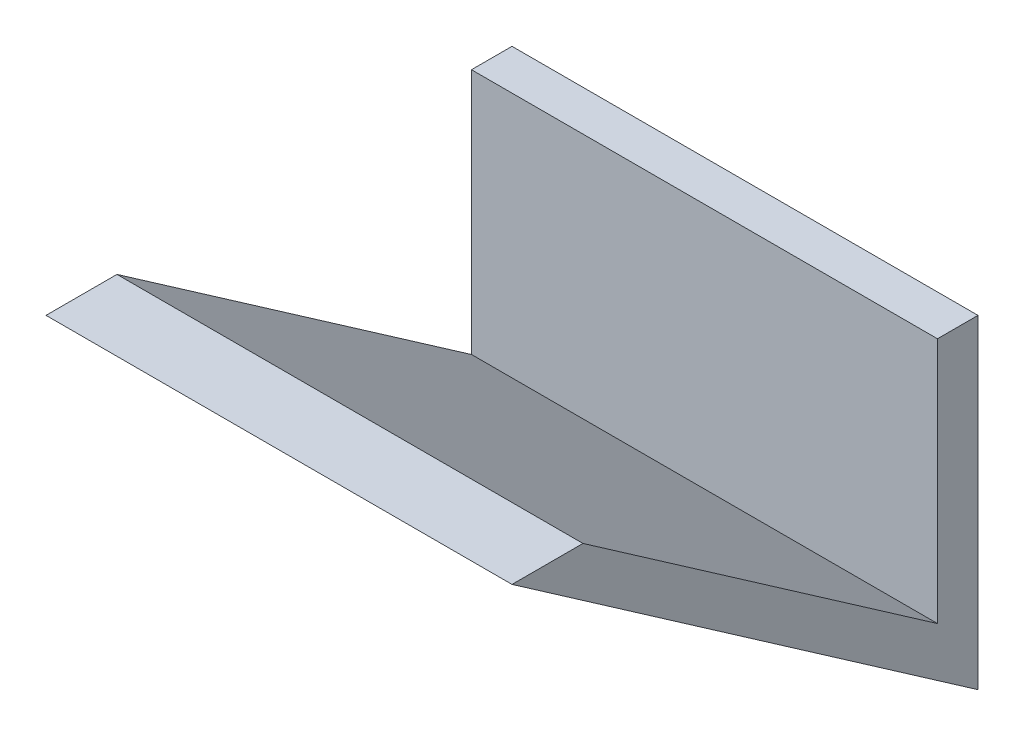
ISO-10303-21;
HEADER;
FILE_DESCRIPTION(('STEP AP214'),'2;1');
FILE_NAME('part.step','',(''),(''),'','','');
FILE_SCHEMA(('AUTOMOTIVE_DESIGN { 1 0 10303 214 1 1 1 1 }'));
ENDSEC;
DATA;
#1=APPLICATION_CONTEXT('core data for automotive mechanical design processes');
#2=APPLICATION_PROTOCOL_DEFINITION('international standard','automotive_design',2000,#1);
#3=PRODUCT_CONTEXT('',#1,'mechanical');
#4=PRODUCT('Part','Part','',(#3));
#5=PRODUCT_RELATED_PRODUCT_CATEGORY('part','',(#4));
#6=PRODUCT_DEFINITION_FORMATION('','',#4);
#7=PRODUCT_DEFINITION_CONTEXT('part definition',#1,'design');
#8=PRODUCT_DEFINITION('design','',#6,#7);
#9=PRODUCT_DEFINITION_SHAPE('','',#8);
#10=(LENGTH_UNIT() NAMED_UNIT(*) SI_UNIT(.MILLI.,.METRE.));
#11=(NAMED_UNIT(*) PLANE_ANGLE_UNIT() SI_UNIT($,.RADIAN.));
#12=(NAMED_UNIT(*) SI_UNIT($,.STERADIAN.) SOLID_ANGLE_UNIT());
#13=UNCERTAINTY_MEASURE_WITH_UNIT(LENGTH_MEASURE(1.E-05),#10,'distance_accuracy_value','');
#14=(GEOMETRIC_REPRESENTATION_CONTEXT(3) GLOBAL_UNCERTAINTY_ASSIGNED_CONTEXT((#13)) GLOBAL_UNIT_ASSIGNED_CONTEXT((#10,
#11,#12)) REPRESENTATION_CONTEXT('',''));
#15=CARTESIAN_POINT('',(0.,0.,0.));
#16=DIRECTION('',(0.,0.,1.));
#17=DIRECTION('',(1.,0.,0.));
#18=AXIS2_PLACEMENT_3D('',#15,#16,#17);
#19=CARTESIAN_POINT('',(-30.7528089887641,27.2640449438202,57.5));
#20=DIRECTION('',(0.,-1.,0.));
#21=DIRECTION('',(0.,0.,-1.));
#22=AXIS2_PLACEMENT_3D('',#19,#20,#21);
#23=PLANE('',#22);
#24=DIRECTION('',(0.,0.,-1.));
#25=VECTOR('',#24,1.);
#26=CARTESIAN_POINT('',(-30.7528089887641,27.2640449438202,57.5));
#27=LINE('',#26,#25);
#28=CARTESIAN_POINT('',(-30.7528089887641,27.2640449438202,5.));
#29=VERTEX_POINT('',#28);
#30=CARTESIAN_POINT('',(-30.7528089887641,27.2640449438202,0.));
#31=VERTEX_POINT('',#30);
#32=EDGE_CURVE('E63',#29,#31,#27,.T.);
#33=ORIENTED_EDGE('',*,*,#32,.F.);
#34=DIRECTION('',(1.,0.,0.));
#35=VECTOR('',#34,1.);
#36=CARTESIAN_POINT('',(-30.7528089887641,27.2640449438202,5.));
#37=LINE('',#36,#35);
#38=CARTESIAN_POINT('',(26.747191011236,27.2640449438202,5.));
#39=VERTEX_POINT('',#38);
#40=EDGE_CURVE('E101',#29,#39,#37,.T.);
#41=ORIENTED_EDGE('',*,*,#40,.T.);
#42=DIRECTION('',(0.,0.,-1.));
#43=VECTOR('',#42,1.);
#44=CARTESIAN_POINT('',(26.747191011236,27.2640449438202,57.5));
#45=LINE('',#44,#43);
#46=CARTESIAN_POINT('',(26.747191011236,27.2640449438202,0.));
#47=VERTEX_POINT('',#46);
#48=EDGE_CURVE('E48',#39,#47,#45,.T.);
#49=ORIENTED_EDGE('',*,*,#48,.T.);
#50=DIRECTION('',(-1.,0.,0.));
#51=VECTOR('',#50,1.);
#52=CARTESIAN_POINT('',(-30.7528089887641,27.2640449438202,0.));
#53=LINE('',#52,#51);
#54=EDGE_CURVE('E135',#47,#31,#53,.T.);
#55=ORIENTED_EDGE('',*,*,#54,.T.);
#56=EDGE_LOOP('',(#33,#41,#49,#55));
#57=FACE_BOUND('',#56,.T.);
#58=ADVANCED_FACE('F39',(#57),#23,.F.);
#59=CARTESIAN_POINT('',(-30.7528089887641,27.2640449438202,57.5));
#60=DIRECTION('',(1.,0.,0.));
#61=DIRECTION('',(0.,1.,0.));
#62=AXIS2_PLACEMENT_3D('',#59,#60,#61);
#63=PLANE('',#62);
#64=DIRECTION('',(0.,-0.5710644881986,-0.820905201785487));
#65=VECTOR('',#64,1.);
#66=CARTESIAN_POINT('',(-30.7528089887641,-3.16685691438766,5.));
#67=LINE('',#66,#65);
#68=CARTESIAN_POINT('',(-30.7528089887641,27.2640449438202,48.7444214211738));
#69=VERTEX_POINT('',#68);
#70=CARTESIAN_POINT('',(-30.7528089887641,-3.16685691438766,5.));
#71=VERTEX_POINT('',#70);
#72=EDGE_CURVE('E55',#69,#71,#67,.T.);
#73=ORIENTED_EDGE('',*,*,#72,.T.);
#74=DIRECTION('',(0.,1.,0.));
#75=VECTOR('',#74,1.);
#76=CARTESIAN_POINT('',(-30.7528089887641,27.2640449438202,5.));
#77=LINE('',#76,#75);
#78=EDGE_CURVE('E104',#71,#29,#77,.T.);
#79=ORIENTED_EDGE('',*,*,#78,.T.);
#80=ORIENTED_EDGE('',*,*,#32,.T.);
#81=DIRECTION('',(0.,-1.,0.));
#82=VECTOR('',#81,1.);
#83=CARTESIAN_POINT('',(-30.7528089887641,27.2640449438202,0.));
#84=LINE('',#83,#82);
#85=CARTESIAN_POINT('',(-30.752808988764,-12.7359550561798,0.));
#86=VERTEX_POINT('',#85);
#87=EDGE_CURVE('E129',#31,#86,#84,.T.);
#88=ORIENTED_EDGE('',*,*,#87,.T.);
#89=DIRECTION('',(0.,0.5710644881986,0.820905201785487));
#90=VECTOR('',#89,1.);
#91=CARTESIAN_POINT('',(-30.7528089887641,27.2640449438202,57.5));
#92=LINE('',#91,#90);
#93=CARTESIAN_POINT('',(-30.7528089887641,27.2640449438202,57.5));
#94=VERTEX_POINT('',#93);
#95=EDGE_CURVE('E126',#86,#94,#92,.T.);
#96=ORIENTED_EDGE('',*,*,#95,.T.);
#97=EDGE_CURVE('E112',#94,#69,#27,.T.);
#98=ORIENTED_EDGE('',*,*,#97,.T.);
#99=EDGE_LOOP('',(#73,#79,#80,#88,#96,#98));
#100=FACE_BOUND('',#99,.T.);
#101=ADVANCED_FACE('F41',(#100),#63,.F.);
#102=CARTESIAN_POINT('',(26.747191011236,27.2640449438202,57.5));
#103=DIRECTION('',(-1.,0.,0.));
#104=DIRECTION('',(0.,-1.,0.));
#105=AXIS2_PLACEMENT_3D('',#102,#103,#104);
#106=PLANE('',#105);
#107=ORIENTED_EDGE('',*,*,#48,.F.);
#108=DIRECTION('',(0.,1.,0.));
#109=VECTOR('',#108,1.);
#110=CARTESIAN_POINT('',(26.747191011236,27.2640449438202,5.));
#111=LINE('',#110,#109);
#112=CARTESIAN_POINT('',(26.747191011236,-3.16685691438765,5.));
#113=VERTEX_POINT('',#112);
#114=EDGE_CURVE('E114',#113,#39,#111,.T.);
#115=ORIENTED_EDGE('',*,*,#114,.F.);
#116=DIRECTION('',(0.,-0.5710644881986,-0.820905201785487));
#117=VECTOR('',#116,1.);
#118=CARTESIAN_POINT('',(26.747191011236,-3.16685691438765,5.));
#119=LINE('',#118,#117);
#120=CARTESIAN_POINT('',(26.747191011236,27.2640449438202,48.7444214211738));
#121=VERTEX_POINT('',#120);
#122=EDGE_CURVE('E97',#121,#113,#119,.T.);
#123=ORIENTED_EDGE('',*,*,#122,.F.);
#124=CARTESIAN_POINT('',(26.747191011236,27.2640449438202,57.5));
#125=VERTEX_POINT('',#124);
#126=EDGE_CURVE('E11',#125,#121,#45,.T.);
#127=ORIENTED_EDGE('',*,*,#126,.F.);
#128=DIRECTION('',(0.,0.5710644881986,0.820905201785487));
#129=VECTOR('',#128,1.);
#130=CARTESIAN_POINT('',(26.747191011236,27.2640449438202,57.5));
#131=LINE('',#130,#129);
#132=CARTESIAN_POINT('',(26.747191011236,-12.7359550561798,0.));
#133=VERTEX_POINT('',#132);
#134=EDGE_CURVE('E122',#133,#125,#131,.T.);
#135=ORIENTED_EDGE('',*,*,#134,.F.);
#136=DIRECTION('',(0.,1.,0.));
#137=VECTOR('',#136,1.);
#138=CARTESIAN_POINT('',(26.747191011236,27.2640449438202,0.));
#139=LINE('',#138,#137);
#140=EDGE_CURVE('E141',#133,#47,#139,.T.);
#141=ORIENTED_EDGE('',*,*,#140,.T.);
#142=EDGE_LOOP('',(#107,#115,#123,#127,#135,#141));
#143=FACE_BOUND('',#142,.T.);
#144=ADVANCED_FACE('F156',(#143),#106,.F.);
#145=ORIENTED_EDGE('',*,*,#126,.T.);
#146=DIRECTION('',(1.,0.,0.));
#147=VECTOR('',#146,1.);
#148=CARTESIAN_POINT('',(-30.7528089887641,27.2640449438202,48.7444214211738));
#149=LINE('',#148,#147);
#150=EDGE_CURVE('E102',#69,#121,#149,.T.);
#151=ORIENTED_EDGE('',*,*,#150,.F.);
#152=ORIENTED_EDGE('',*,*,#97,.F.);
#153=DIRECTION('',(-1.,0.,0.));
#154=VECTOR('',#153,1.);
#155=CARTESIAN_POINT('',(-30.7528089887641,27.2640449438202,57.5));
#156=LINE('',#155,#154);
#157=EDGE_CURVE('E132',#125,#94,#156,.T.);
#158=ORIENTED_EDGE('',*,*,#157,.F.);
#159=EDGE_LOOP('',(#145,#151,#152,#158));
#160=FACE_BOUND('',#159,.T.);
#161=ADVANCED_FACE('F164',(#160),#23,.F.);
#162=CARTESIAN_POINT('',(0.,0.,0.));
#163=DIRECTION('',(0.,0.,1.));
#164=DIRECTION('',(1.,0.,0.));
#165=AXIS2_PLACEMENT_3D('',#162,#163,#164);
#166=PLANE('',#165);
#167=ORIENTED_EDGE('',*,*,#87,.F.);
#168=ORIENTED_EDGE('',*,*,#54,.F.);
#169=ORIENTED_EDGE('',*,*,#140,.F.);
#170=DIRECTION('',(1.,0.,0.));
#171=VECTOR('',#170,1.);
#172=CARTESIAN_POINT('',(-30.752808988764,-12.7359550561798,0.));
#173=LINE('',#172,#171);
#174=EDGE_CURVE('E138',#86,#133,#173,.T.);
#175=ORIENTED_EDGE('',*,*,#174,.F.);
#176=EDGE_LOOP('',(#167,#168,#169,#175));
#177=FACE_BOUND('',#176,.T.);
#178=ADVANCED_FACE('F160',(#177),#166,.F.);
#179=CARTESIAN_POINT('',(-30.7528089887641,27.2640449438202,57.5));
#180=DIRECTION('',(0.,0.820905201785487,-0.5710644881986));
#181=DIRECTION('',(0.,0.5710644881986,0.820905201785487));
#182=AXIS2_PLACEMENT_3D('',#179,#180,#181);
#183=PLANE('',#182);
#184=ORIENTED_EDGE('',*,*,#134,.T.);
#185=ORIENTED_EDGE('',*,*,#157,.T.);
#186=ORIENTED_EDGE('',*,*,#95,.F.);
#187=ORIENTED_EDGE('',*,*,#174,.T.);
#188=EDGE_LOOP('',(#184,#185,#186,#187));
#189=FACE_BOUND('',#188,.T.);
#190=ADVANCED_FACE('F165',(#189),#183,.F.);
#191=CARTESIAN_POINT('',(-30.7528089887641,27.2640449438202,5.));
#192=DIRECTION('',(0.,0.,-1.));
#193=DIRECTION('',(0.,1.,0.));
#194=AXIS2_PLACEMENT_3D('',#191,#192,#193);
#195=PLANE('',#194);
#196=ORIENTED_EDGE('',*,*,#114,.T.);
#197=ORIENTED_EDGE('',*,*,#40,.F.);
#198=ORIENTED_EDGE('',*,*,#78,.F.);
#199=DIRECTION('',(1.,0.,0.));
#200=VECTOR('',#199,1.);
#201=CARTESIAN_POINT('',(-30.7528089887641,-3.16685691438766,5.));
#202=LINE('',#201,#200);
#203=EDGE_CURVE('E93',#71,#113,#202,.T.);
#204=ORIENTED_EDGE('',*,*,#203,.T.);
#205=EDGE_LOOP('',(#196,#197,#198,#204));
#206=FACE_BOUND('',#205,.T.);
#207=ADVANCED_FACE('F105',(#206),#195,.F.);
#208=CARTESIAN_POINT('',(-30.7528089887641,-3.16685691438766,5.));
#209=DIRECTION('',(0.,-0.820905201785487,0.5710644881986));
#210=DIRECTION('',(0.,-0.5710644881986,-0.820905201785487));
#211=AXIS2_PLACEMENT_3D('',#208,#209,#210);
#212=PLANE('',#211);
#213=ORIENTED_EDGE('',*,*,#122,.T.);
#214=ORIENTED_EDGE('',*,*,#203,.F.);
#215=ORIENTED_EDGE('',*,*,#72,.F.);
#216=ORIENTED_EDGE('',*,*,#150,.T.);
#217=EDGE_LOOP('',(#213,#214,#215,#216));
#218=FACE_BOUND('',#217,.T.);
#219=ADVANCED_FACE('F95',(#218),#212,.F.);
#220=CLOSED_SHELL('',(#58,#101,#144,#161,#178,#190,#207,#219));
#221=MANIFOLD_SOLID_BREP('B2',#220);
#222=ADVANCED_BREP_SHAPE_REPRESENTATION('',(#18,#221),#14);
#223=SHAPE_DEFINITION_REPRESENTATION(#9,#222);
ENDSEC;
END-ISO-10303-21;
